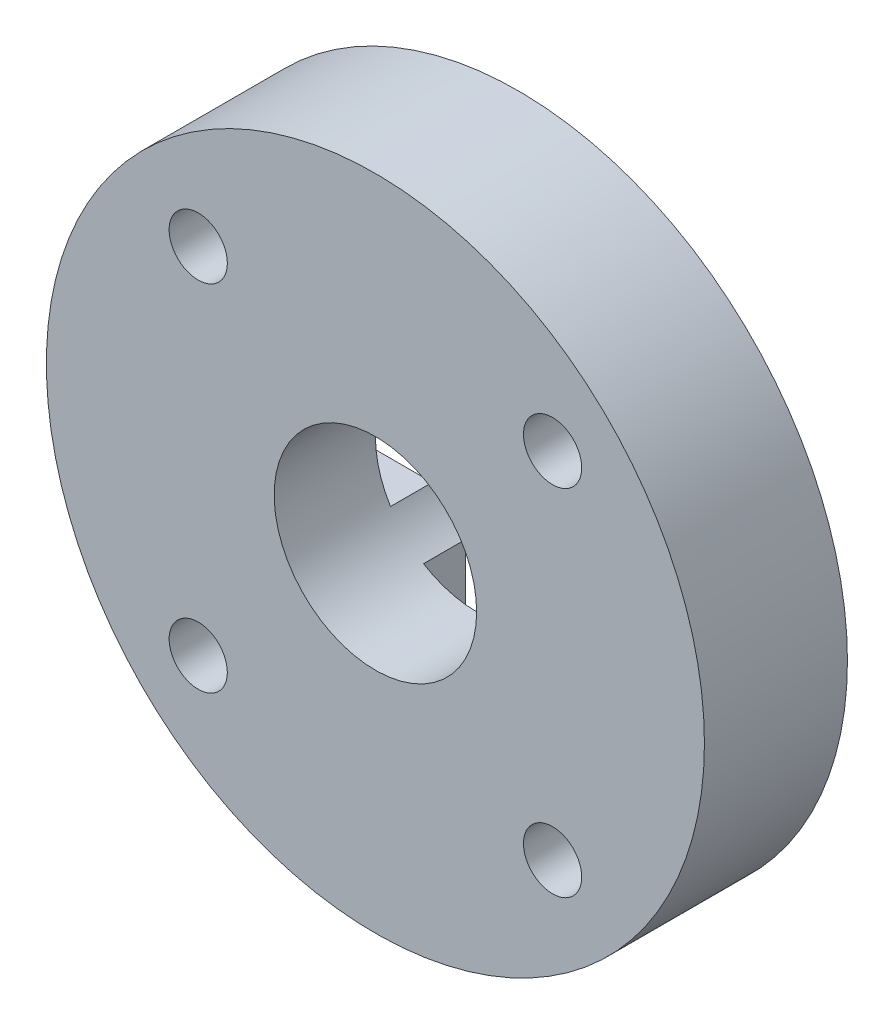
ISO-10303-21;
HEADER;
FILE_DESCRIPTION(('STEP AP214'),'2;1');
FILE_NAME('part.step','',(''),(''),'','','');
FILE_SCHEMA(('AUTOMOTIVE_DESIGN { 1 0 10303 214 1 1 1 1 }'));
ENDSEC;
DATA;
#1=APPLICATION_CONTEXT('core data for automotive mechanical design processes');
#2=APPLICATION_PROTOCOL_DEFINITION('international standard','automotive_design',2000,#1);
#3=PRODUCT_CONTEXT('',#1,'mechanical');
#4=PRODUCT('Part','Part','',(#3));
#5=PRODUCT_RELATED_PRODUCT_CATEGORY('part','',(#4));
#6=PRODUCT_DEFINITION_FORMATION('','',#4);
#7=PRODUCT_DEFINITION_CONTEXT('part definition',#1,'design');
#8=PRODUCT_DEFINITION('design','',#6,#7);
#9=PRODUCT_DEFINITION_SHAPE('','',#8);
#10=(LENGTH_UNIT() NAMED_UNIT(*) SI_UNIT(.MILLI.,.METRE.));
#11=(NAMED_UNIT(*) PLANE_ANGLE_UNIT() SI_UNIT($,.RADIAN.));
#12=(NAMED_UNIT(*) SI_UNIT($,.STERADIAN.) SOLID_ANGLE_UNIT());
#13=UNCERTAINTY_MEASURE_WITH_UNIT(LENGTH_MEASURE(1.E-05),#10,'distance_accuracy_value','');
#14=(GEOMETRIC_REPRESENTATION_CONTEXT(3) GLOBAL_UNCERTAINTY_ASSIGNED_CONTEXT((#13)) GLOBAL_UNIT_ASSIGNED_CONTEXT((#10,
#11,#12)) REPRESENTATION_CONTEXT('',''));
#15=CARTESIAN_POINT('',(0.,0.,0.));
#16=DIRECTION('',(0.,0.,1.));
#17=DIRECTION('',(1.,0.,0.));
#18=AXIS2_PLACEMENT_3D('',#15,#16,#17);
#19=CARTESIAN_POINT('',(0.,0.,-1.65));
#20=DIRECTION('',(0.,0.,1.));
#21=DIRECTION('',(1.,0.,0.));
#22=AXIS2_PLACEMENT_3D('',#19,#20,#21);
#23=PLANE('',#22);
#24=CARTESIAN_POINT('',(7.,-7.,-1.65));
#25=DIRECTION('',(0.,0.,1.));
#26=DIRECTION('',(1.,0.,0.));
#27=AXIS2_PLACEMENT_3D('',#24,#25,#26);
#28=CIRCLE('',#27,1.15);
#29=CARTESIAN_POINT('',(8.15,-7.,-1.65));
#30=VERTEX_POINT('',#29);
#31=EDGE_CURVE('E268',#30,#30,#28,.F.);
#32=ORIENTED_EDGE('',*,*,#31,.F.);
#33=EDGE_LOOP('',(#32));
#34=FACE_BOUND('',#33,.T.);
#35=CARTESIAN_POINT('',(-7.,-7.,-1.65));
#36=DIRECTION('',(0.,0.,1.));
#37=DIRECTION('',(1.,0.,0.));
#38=AXIS2_PLACEMENT_3D('',#35,#36,#37);
#39=CIRCLE('',#38,1.15);
#40=CARTESIAN_POINT('',(-5.85,-7.,-1.65));
#41=VERTEX_POINT('',#40);
#42=EDGE_CURVE('E289',#41,#41,#39,.F.);
#43=ORIENTED_EDGE('',*,*,#42,.F.);
#44=EDGE_LOOP('',(#43));
#45=FACE_BOUND('',#44,.T.);
#46=CARTESIAN_POINT('',(-7.,7.,-1.65));
#47=DIRECTION('',(0.,0.,1.));
#48=DIRECTION('',(1.,0.,0.));
#49=AXIS2_PLACEMENT_3D('',#46,#47,#48);
#50=CIRCLE('',#49,1.15);
#51=CARTESIAN_POINT('',(-5.85,7.,-1.65));
#52=VERTEX_POINT('',#51);
#53=EDGE_CURVE('E291',#52,#52,#50,.F.);
#54=ORIENTED_EDGE('',*,*,#53,.F.);
#55=EDGE_LOOP('',(#54));
#56=FACE_BOUND('',#55,.T.);
#57=CARTESIAN_POINT('',(7.,7.,-1.65));
#58=DIRECTION('',(0.,0.,1.));
#59=DIRECTION('',(1.,0.,0.));
#60=AXIS2_PLACEMENT_3D('',#57,#58,#59);
#61=CIRCLE('',#60,1.15);
#62=CARTESIAN_POINT('',(8.15,7.,-1.65));
#63=VERTEX_POINT('',#62);
#64=EDGE_CURVE('E300',#63,#63,#61,.F.);
#65=ORIENTED_EDGE('',*,*,#64,.F.);
#66=EDGE_LOOP('',(#65));
#67=FACE_BOUND('',#66,.T.);
#68=CARTESIAN_POINT('',(0.,0.,-1.65));
#69=DIRECTION('',(0.,0.,1.));
#70=DIRECTION('',(1.,0.,0.));
#71=AXIS2_PLACEMENT_3D('',#68,#69,#70);
#72=CIRCLE('',#71,13.);
#73=CARTESIAN_POINT('',(13.,0.,-1.65));
#74=VERTEX_POINT('',#73);
#75=EDGE_CURVE('E215',#74,#74,#72,.T.);
#76=ORIENTED_EDGE('',*,*,#75,.F.);
#77=EDGE_LOOP('',(#76));
#78=FACE_BOUND('',#77,.T.);
#79=DIRECTION('',(-1.,0.,0.));
#80=VECTOR('',#79,1.);
#81=CARTESIAN_POINT('',(-8.15,2.1,-1.65));
#82=LINE('',#81,#80);
#83=CARTESIAN_POINT('',(8.15,2.1,-1.65));
#84=VERTEX_POINT('',#83);
#85=CARTESIAN_POINT('',(3.40440890610984,2.1,-1.65));
#86=VERTEX_POINT('',#85);
#87=EDGE_CURVE('E172',#84,#86,#82,.T.);
#88=ORIENTED_EDGE('',*,*,#87,.T.);
#89=CARTESIAN_POINT('',(0.,0.,-1.65));
#90=DIRECTION('',(0.,0.,1.));
#91=DIRECTION('',(1.,0.,0.));
#92=AXIS2_PLACEMENT_3D('',#89,#90,#91);
#93=CIRCLE('',#92,4.);
#94=CARTESIAN_POINT('',(2.1,3.40440890610984,-1.65));
#95=VERTEX_POINT('',#94);
#96=EDGE_CURVE('E151',#86,#95,#93,.T.);
#97=ORIENTED_EDGE('',*,*,#96,.T.);
#98=DIRECTION('',(0.,1.,0.));
#99=VECTOR('',#98,1.);
#100=CARTESIAN_POINT('',(2.1,-8.15,-1.65));
#101=LINE('',#100,#99);
#102=CARTESIAN_POINT('',(2.1,8.15,-1.65));
#103=VERTEX_POINT('',#102);
#104=EDGE_CURVE('E226',#95,#103,#101,.T.);
#105=ORIENTED_EDGE('',*,*,#104,.T.);
#106=CARTESIAN_POINT('',(0.,8.15,-1.65));
#107=DIRECTION('',(0.,0.,1.));
#108=DIRECTION('',(1.,0.,0.));
#109=AXIS2_PLACEMENT_3D('',#106,#107,#108);
#110=CIRCLE('',#109,2.1);
#111=CARTESIAN_POINT('',(-2.1,8.15,-1.65));
#112=VERTEX_POINT('',#111);
#113=EDGE_CURVE('E274',#103,#112,#110,.T.);
#114=ORIENTED_EDGE('',*,*,#113,.T.);
#115=DIRECTION('',(0.,-1.,0.));
#116=VECTOR('',#115,1.);
#117=CARTESIAN_POINT('',(-2.1,-8.15,-1.65));
#118=LINE('',#117,#116);
#119=CARTESIAN_POINT('',(-2.1,3.40440890610984,-1.65));
#120=VERTEX_POINT('',#119);
#121=EDGE_CURVE('E238',#112,#120,#118,.T.);
#122=ORIENTED_EDGE('',*,*,#121,.T.);
#123=CARTESIAN_POINT('',(-3.40440890610984,2.1,-1.65));
#124=VERTEX_POINT('',#123);
#125=EDGE_CURVE('E62',#120,#124,#93,.T.);
#126=ORIENTED_EDGE('',*,*,#125,.T.);
#127=CARTESIAN_POINT('',(-8.15,2.1,-1.65));
#128=VERTEX_POINT('',#127);
#129=EDGE_CURVE('E187',#124,#128,#82,.T.);
#130=ORIENTED_EDGE('',*,*,#129,.T.);
#131=CARTESIAN_POINT('',(-8.15,0.,-1.65));
#132=DIRECTION('',(0.,0.,1.));
#133=DIRECTION('',(1.,0.,0.));
#134=AXIS2_PLACEMENT_3D('',#131,#132,#133);
#135=CIRCLE('',#134,2.1);
#136=CARTESIAN_POINT('',(-8.15,-2.1,-1.65));
#137=VERTEX_POINT('',#136);
#138=EDGE_CURVE('E278',#128,#137,#135,.T.);
#139=ORIENTED_EDGE('',*,*,#138,.T.);
#140=DIRECTION('',(1.,0.,0.));
#141=VECTOR('',#140,1.);
#142=CARTESIAN_POINT('',(-8.15,-2.1,-1.65));
#143=LINE('',#142,#141);
#144=CARTESIAN_POINT('',(-3.40440890610984,-2.1,-1.65));
#145=VERTEX_POINT('',#144);
#146=EDGE_CURVE('E194',#137,#145,#143,.T.);
#147=ORIENTED_EDGE('',*,*,#146,.T.);
#148=CARTESIAN_POINT('',(-2.1,-3.40440890610984,-1.65));
#149=VERTEX_POINT('',#148);
#150=EDGE_CURVE('E637',#145,#149,#93,.T.);
#151=ORIENTED_EDGE('',*,*,#150,.T.);
#152=CARTESIAN_POINT('',(-2.1,-8.15,-1.65));
#153=VERTEX_POINT('',#152);
#154=EDGE_CURVE('E53',#149,#153,#118,.T.);
#155=ORIENTED_EDGE('',*,*,#154,.T.);
#156=CARTESIAN_POINT('',(0.,-8.15,-1.65));
#157=DIRECTION('',(0.,0.,1.));
#158=DIRECTION('',(1.,0.,0.));
#159=AXIS2_PLACEMENT_3D('',#156,#157,#158);
#160=CIRCLE('',#159,2.1);
#161=CARTESIAN_POINT('',(2.1,-8.15,-1.65));
#162=VERTEX_POINT('',#161);
#163=EDGE_CURVE('E270',#153,#162,#160,.T.);
#164=ORIENTED_EDGE('',*,*,#163,.T.);
#165=CARTESIAN_POINT('',(2.1,-3.40440890610984,-1.65));
#166=VERTEX_POINT('',#165);
#167=EDGE_CURVE('E231',#162,#166,#101,.T.);
#168=ORIENTED_EDGE('',*,*,#167,.T.);
#169=CARTESIAN_POINT('',(3.40440890610984,-2.1,-1.65));
#170=VERTEX_POINT('',#169);
#171=EDGE_CURVE('E67',#166,#170,#93,.T.);
#172=ORIENTED_EDGE('',*,*,#171,.T.);
#173=CARTESIAN_POINT('',(8.15,-2.1,-1.65));
#174=VERTEX_POINT('',#173);
#175=EDGE_CURVE('E354',#170,#174,#143,.T.);
#176=ORIENTED_EDGE('',*,*,#175,.T.);
#177=CARTESIAN_POINT('',(8.15,0.,-1.65));
#178=DIRECTION('',(0.,0.,1.));
#179=DIRECTION('',(1.,0.,0.));
#180=AXIS2_PLACEMENT_3D('',#177,#178,#179);
#181=CIRCLE('',#180,2.1);
#182=EDGE_CURVE('E182',#174,#84,#181,.T.);
#183=ORIENTED_EDGE('',*,*,#182,.T.);
#184=EDGE_LOOP('',(#88,#97,#105,#114,#122,#126,#130,#139,#147,#151,#155,#164,#168,#172,#176,#183));
#185=FACE_BOUND('',#184,.T.);
#186=ADVANCED_FACE('F44',(#34,#45,#56,#67,#78,#185),#23,.F.);
#187=CARTESIAN_POINT('',(-8.15,-2.1,0.));
#188=DIRECTION('',(0.,1.,0.));
#189=DIRECTION('',(0.,0.,1.));
#190=AXIS2_PLACEMENT_3D('',#187,#188,#189);
#191=PLANE('',#190);
#192=ORIENTED_EDGE('',*,*,#175,.F.);
#193=DIRECTION('',(0.,0.,-1.));
#194=VECTOR('',#193,1.);
#195=CARTESIAN_POINT('',(3.40440890610984,-2.1,0.));
#196=LINE('',#195,#194);
#197=CARTESIAN_POINT('',(3.40440890610984,-2.1,0.));
#198=VERTEX_POINT('',#197);
#199=EDGE_CURVE('E178',#170,#198,#196,.F.);
#200=ORIENTED_EDGE('',*,*,#199,.T.);
#201=DIRECTION('',(1.,0.,0.));
#202=VECTOR('',#201,1.);
#203=CARTESIAN_POINT('',(-8.15,-2.1,0.));
#204=LINE('',#203,#202);
#205=CARTESIAN_POINT('',(8.15,-2.1,0.));
#206=VERTEX_POINT('',#205);
#207=EDGE_CURVE('E184',#198,#206,#204,.T.);
#208=ORIENTED_EDGE('',*,*,#207,.T.);
#209=DIRECTION('',(0.,0.,-1.));
#210=VECTOR('',#209,1.);
#211=CARTESIAN_POINT('',(8.15,-2.1,0.));
#212=LINE('',#211,#210);
#213=EDGE_CURVE('E204',#206,#174,#212,.T.);
#214=ORIENTED_EDGE('',*,*,#213,.T.);
#215=EDGE_LOOP('',(#192,#200,#208,#214));
#216=FACE_BOUND('',#215,.T.);
#217=ADVANCED_FACE('F407',(#216),#191,.T.);
#218=CARTESIAN_POINT('',(-8.15,2.1,0.));
#219=DIRECTION('',(0.,-1.,0.));
#220=DIRECTION('',(0.,0.,-1.));
#221=AXIS2_PLACEMENT_3D('',#218,#219,#220);
#222=PLANE('',#221);
#223=DIRECTION('',(-1.,0.,0.));
#224=VECTOR('',#223,1.);
#225=CARTESIAN_POINT('',(-8.15,2.1,0.));
#226=LINE('',#225,#224);
#227=CARTESIAN_POINT('',(8.15,2.1,0.));
#228=VERTEX_POINT('',#227);
#229=CARTESIAN_POINT('',(3.40440890610984,2.1,0.));
#230=VERTEX_POINT('',#229);
#231=EDGE_CURVE('E176',#228,#230,#226,.T.);
#232=ORIENTED_EDGE('',*,*,#231,.T.);
#233=DIRECTION('',(0.,0.,-1.));
#234=VECTOR('',#233,1.);
#235=CARTESIAN_POINT('',(3.40440890610984,2.1,0.));
#236=LINE('',#235,#234);
#237=EDGE_CURVE('E156',#230,#86,#236,.T.);
#238=ORIENTED_EDGE('',*,*,#237,.T.);
#239=ORIENTED_EDGE('',*,*,#87,.F.);
#240=DIRECTION('',(0.,0.,-1.));
#241=VECTOR('',#240,1.);
#242=CARTESIAN_POINT('',(8.15,2.1,0.));
#243=LINE('',#242,#241);
#244=EDGE_CURVE('E202',#228,#84,#243,.T.);
#245=ORIENTED_EDGE('',*,*,#244,.F.);
#246=EDGE_LOOP('',(#232,#238,#239,#245));
#247=FACE_BOUND('',#246,.T.);
#248=ADVANCED_FACE('F175',(#247),#222,.T.);
#249=ORIENTED_EDGE('',*,*,#129,.F.);
#250=DIRECTION('',(0.,0.,-1.));
#251=VECTOR('',#250,1.);
#252=CARTESIAN_POINT('',(-3.40440890610984,2.1,0.));
#253=LINE('',#252,#251);
#254=CARTESIAN_POINT('',(-3.40440890610984,2.1,0.));
#255=VERTEX_POINT('',#254);
#256=EDGE_CURVE('E177',#124,#255,#253,.F.);
#257=ORIENTED_EDGE('',*,*,#256,.T.);
#258=CARTESIAN_POINT('',(-8.15,2.1,0.));
#259=VERTEX_POINT('',#258);
#260=EDGE_CURVE('E359',#255,#259,#226,.T.);
#261=ORIENTED_EDGE('',*,*,#260,.T.);
#262=DIRECTION('',(0.,0.,-1.));
#263=VECTOR('',#262,1.);
#264=CARTESIAN_POINT('',(-8.15,2.1,0.));
#265=LINE('',#264,#263);
#266=EDGE_CURVE('E199',#259,#128,#265,.T.);
#267=ORIENTED_EDGE('',*,*,#266,.T.);
#268=EDGE_LOOP('',(#249,#257,#261,#267));
#269=FACE_BOUND('',#268,.T.);
#270=ADVANCED_FACE('F370',(#269),#222,.T.);
#271=CARTESIAN_POINT('',(-8.15,-2.1,0.));
#272=VERTEX_POINT('',#271);
#273=CARTESIAN_POINT('',(-3.40440890610984,-2.1,0.));
#274=VERTEX_POINT('',#273);
#275=EDGE_CURVE('E192',#272,#274,#204,.T.);
#276=ORIENTED_EDGE('',*,*,#275,.T.);
#277=DIRECTION('',(0.,0.,-1.));
#278=VECTOR('',#277,1.);
#279=CARTESIAN_POINT('',(-3.40440890610984,-2.1,0.));
#280=LINE('',#279,#278);
#281=EDGE_CURVE('E322',#274,#145,#280,.T.);
#282=ORIENTED_EDGE('',*,*,#281,.T.);
#283=ORIENTED_EDGE('',*,*,#146,.F.);
#284=DIRECTION('',(0.,0.,-1.));
#285=VECTOR('',#284,1.);
#286=CARTESIAN_POINT('',(-8.15,-2.1,0.));
#287=LINE('',#286,#285);
#288=EDGE_CURVE('E206',#272,#137,#287,.T.);
#289=ORIENTED_EDGE('',*,*,#288,.F.);
#290=EDGE_LOOP('',(#276,#282,#283,#289));
#291=FACE_BOUND('',#290,.T.);
#292=ADVANCED_FACE('F411',(#291),#191,.T.);
#293=CARTESIAN_POINT('',(2.1,-8.15,0.));
#294=DIRECTION('',(-1.,0.,0.));
#295=DIRECTION('',(0.,0.,1.));
#296=AXIS2_PLACEMENT_3D('',#293,#294,#295);
#297=PLANE('',#296);
#298=ORIENTED_EDGE('',*,*,#104,.F.);
#299=DIRECTION('',(0.,0.,-1.));
#300=VECTOR('',#299,1.);
#301=CARTESIAN_POINT('',(2.1,3.40440890610984,0.));
#302=LINE('',#301,#300);
#303=CARTESIAN_POINT('',(2.1,3.40440890610984,0.));
#304=VERTEX_POINT('',#303);
#305=EDGE_CURVE('E162',#95,#304,#302,.F.);
#306=ORIENTED_EDGE('',*,*,#305,.T.);
#307=DIRECTION('',(0.,1.,0.));
#308=VECTOR('',#307,1.);
#309=CARTESIAN_POINT('',(2.1,-8.15,0.));
#310=LINE('',#309,#308);
#311=CARTESIAN_POINT('',(2.1,8.15,0.));
#312=VERTEX_POINT('',#311);
#313=EDGE_CURVE('E258',#304,#312,#310,.T.);
#314=ORIENTED_EDGE('',*,*,#313,.T.);
#315=DIRECTION('',(0.,0.,-1.));
#316=VECTOR('',#315,1.);
#317=CARTESIAN_POINT('',(2.1,8.15,0.));
#318=LINE('',#317,#316);
#319=EDGE_CURVE('E346',#312,#103,#318,.T.);
#320=ORIENTED_EDGE('',*,*,#319,.T.);
#321=EDGE_LOOP('',(#298,#306,#314,#320));
#322=FACE_BOUND('',#321,.T.);
#323=ADVANCED_FACE('F393',(#322),#297,.T.);
#324=CARTESIAN_POINT('',(-2.1,-8.15,0.));
#325=DIRECTION('',(1.,0.,0.));
#326=DIRECTION('',(0.,0.,-1.));
#327=AXIS2_PLACEMENT_3D('',#324,#325,#326);
#328=PLANE('',#327);
#329=DIRECTION('',(0.,-1.,0.));
#330=VECTOR('',#329,1.);
#331=CARTESIAN_POINT('',(-2.1,-8.15,0.));
#332=LINE('',#331,#330);
#333=CARTESIAN_POINT('',(-2.1,8.15,0.));
#334=VERTEX_POINT('',#333);
#335=CARTESIAN_POINT('',(-2.1,3.40440890610984,0.));
#336=VERTEX_POINT('',#335);
#337=EDGE_CURVE('E247',#334,#336,#332,.T.);
#338=ORIENTED_EDGE('',*,*,#337,.T.);
#339=DIRECTION('',(0.,0.,-1.));
#340=VECTOR('',#339,1.);
#341=CARTESIAN_POINT('',(-2.1,3.40440890610984,0.));
#342=LINE('',#341,#340);
#343=EDGE_CURVE('E329',#336,#120,#342,.T.);
#344=ORIENTED_EDGE('',*,*,#343,.T.);
#345=ORIENTED_EDGE('',*,*,#121,.F.);
#346=DIRECTION('',(0.,0.,-1.));
#347=VECTOR('',#346,1.);
#348=CARTESIAN_POINT('',(-2.1,8.15,0.));
#349=LINE('',#348,#347);
#350=EDGE_CURVE('E256',#334,#112,#349,.T.);
#351=ORIENTED_EDGE('',*,*,#350,.F.);
#352=EDGE_LOOP('',(#338,#344,#345,#351));
#353=FACE_BOUND('',#352,.T.);
#354=ADVANCED_FACE('F387',(#353),#328,.T.);
#355=ORIENTED_EDGE('',*,*,#154,.F.);
#356=DIRECTION('',(0.,0.,-1.));
#357=VECTOR('',#356,1.);
#358=CARTESIAN_POINT('',(-2.1,-3.40440890610984,0.));
#359=LINE('',#358,#357);
#360=CARTESIAN_POINT('',(-2.1,-3.40440890610984,0.));
#361=VERTEX_POINT('',#360);
#362=EDGE_CURVE('E170',#149,#361,#359,.F.);
#363=ORIENTED_EDGE('',*,*,#362,.T.);
#364=CARTESIAN_POINT('',(-2.1,-8.15,0.));
#365=VERTEX_POINT('',#364);
#366=EDGE_CURVE('E245',#361,#365,#332,.T.);
#367=ORIENTED_EDGE('',*,*,#366,.T.);
#368=DIRECTION('',(0.,0.,-1.));
#369=VECTOR('',#368,1.);
#370=CARTESIAN_POINT('',(-2.1,-8.15,0.));
#371=LINE('',#370,#369);
#372=EDGE_CURVE('E350',#365,#153,#371,.T.);
#373=ORIENTED_EDGE('',*,*,#372,.T.);
#374=EDGE_LOOP('',(#355,#363,#367,#373));
#375=FACE_BOUND('',#374,.T.);
#376=ADVANCED_FACE('F334',(#375),#328,.T.);
#377=CARTESIAN_POINT('',(2.1,-8.15,0.));
#378=VERTEX_POINT('',#377);
#379=CARTESIAN_POINT('',(2.1,-3.40440890610984,0.));
#380=VERTEX_POINT('',#379);
#381=EDGE_CURVE('E257',#378,#380,#310,.T.);
#382=ORIENTED_EDGE('',*,*,#381,.T.);
#383=DIRECTION('',(0.,0.,-1.));
#384=VECTOR('',#383,1.);
#385=CARTESIAN_POINT('',(2.1,-3.40440890610984,0.));
#386=LINE('',#385,#384);
#387=EDGE_CURVE('E11',#380,#166,#386,.T.);
#388=ORIENTED_EDGE('',*,*,#387,.T.);
#389=ORIENTED_EDGE('',*,*,#167,.F.);
#390=DIRECTION('',(0.,0.,-1.));
#391=VECTOR('',#390,1.);
#392=CARTESIAN_POINT('',(2.1,-8.15,0.));
#393=LINE('',#392,#391);
#394=EDGE_CURVE('E343',#378,#162,#393,.T.);
#395=ORIENTED_EDGE('',*,*,#394,.F.);
#396=EDGE_LOOP('',(#382,#388,#389,#395));
#397=FACE_BOUND('',#396,.T.);
#398=ADVANCED_FACE('F344',(#397),#297,.T.);
#399=CARTESIAN_POINT('',(0.,0.,4.));
#400=DIRECTION('',(0.,0.,1.));
#401=DIRECTION('',(1.,0.,0.));
#402=AXIS2_PLACEMENT_3D('',#399,#400,#401);
#403=PLANE('',#402);
#404=CARTESIAN_POINT('',(7.,-7.,4.));
#405=DIRECTION('',(0.,0.,1.));
#406=DIRECTION('',(1.,0.,0.));
#407=AXIS2_PLACEMENT_3D('',#404,#405,#406);
#408=CIRCLE('',#407,1.15);
#409=CARTESIAN_POINT('',(8.15,-7.,4.));
#410=VERTEX_POINT('',#409);
#411=EDGE_CURVE('E306',#410,#410,#408,.T.);
#412=ORIENTED_EDGE('',*,*,#411,.F.);
#413=EDGE_LOOP('',(#412));
#414=FACE_BOUND('',#413,.T.);
#415=CARTESIAN_POINT('',(-7.,-7.,4.));
#416=DIRECTION('',(0.,0.,1.));
#417=DIRECTION('',(1.,0.,0.));
#418=AXIS2_PLACEMENT_3D('',#415,#416,#417);
#419=CIRCLE('',#418,1.15);
#420=CARTESIAN_POINT('',(-5.85,-7.,4.));
#421=VERTEX_POINT('',#420);
#422=EDGE_CURVE('E309',#421,#421,#419,.T.);
#423=ORIENTED_EDGE('',*,*,#422,.F.);
#424=EDGE_LOOP('',(#423));
#425=FACE_BOUND('',#424,.T.);
#426=CARTESIAN_POINT('',(-7.,7.,4.));
#427=DIRECTION('',(0.,0.,1.));
#428=DIRECTION('',(1.,0.,0.));
#429=AXIS2_PLACEMENT_3D('',#426,#427,#428);
#430=CIRCLE('',#429,1.15);
#431=CARTESIAN_POINT('',(-5.85,7.,4.));
#432=VERTEX_POINT('',#431);
#433=EDGE_CURVE('E304',#432,#432,#430,.T.);
#434=ORIENTED_EDGE('',*,*,#433,.F.);
#435=EDGE_LOOP('',(#434));
#436=FACE_BOUND('',#435,.T.);
#437=CARTESIAN_POINT('',(7.,7.,4.));
#438=DIRECTION('',(0.,0.,1.));
#439=DIRECTION('',(1.,0.,0.));
#440=AXIS2_PLACEMENT_3D('',#437,#438,#439);
#441=CIRCLE('',#440,1.15);
#442=CARTESIAN_POINT('',(8.15,7.,4.));
#443=VERTEX_POINT('',#442);
#444=EDGE_CURVE('E301',#443,#443,#441,.T.);
#445=ORIENTED_EDGE('',*,*,#444,.F.);
#446=EDGE_LOOP('',(#445));
#447=FACE_BOUND('',#446,.T.);
#448=CARTESIAN_POINT('',(0.,0.,4.));
#449=DIRECTION('',(0.,0.,1.));
#450=DIRECTION('',(1.,0.,0.));
#451=AXIS2_PLACEMENT_3D('',#448,#449,#450);
#452=CIRCLE('',#451,13.);
#453=CARTESIAN_POINT('',(13.,0.,4.));
#454=VERTEX_POINT('',#453);
#455=EDGE_CURVE('E225',#454,#454,#452,.T.);
#456=ORIENTED_EDGE('',*,*,#455,.T.);
#457=EDGE_LOOP('',(#456));
#458=FACE_BOUND('',#457,.T.);
#459=CARTESIAN_POINT('',(0.,0.,4.));
#460=DIRECTION('',(0.,0.,1.));
#461=DIRECTION('',(1.,0.,0.));
#462=AXIS2_PLACEMENT_3D('',#459,#460,#461);
#463=CIRCLE('',#462,4.);
#464=CARTESIAN_POINT('',(4.,0.,4.));
#465=VERTEX_POINT('',#464);
#466=EDGE_CURVE('E217',#465,#465,#463,.T.);
#467=ORIENTED_EDGE('',*,*,#466,.F.);
#468=EDGE_LOOP('',(#467));
#469=FACE_BOUND('',#468,.T.);
#470=ADVANCED_FACE('F421',(#414,#425,#436,#447,#458,#469),#403,.T.);
#471=CARTESIAN_POINT('',(0.,0.,4.));
#472=DIRECTION('',(0.,0.,-1.));
#473=DIRECTION('',(-1.,0.,0.));
#474=AXIS2_PLACEMENT_3D('',#471,#472,#473);
#475=CYLINDRICAL_SURFACE('',#474,13.);
#476=ORIENTED_EDGE('',*,*,#455,.F.);
#477=EDGE_LOOP('',(#476));
#478=FACE_BOUND('',#477,.T.);
#479=ORIENTED_EDGE('',*,*,#75,.T.);
#480=EDGE_LOOP('',(#479));
#481=FACE_BOUND('',#480,.T.);
#482=ADVANCED_FACE('F50',(#478,#481),#475,.T.);
#483=CARTESIAN_POINT('',(0.,0.,4.));
#484=DIRECTION('',(0.,0.,-1.));
#485=DIRECTION('',(-1.,0.,0.));
#486=AXIS2_PLACEMENT_3D('',#483,#484,#485);
#487=CYLINDRICAL_SURFACE('',#486,4.);
#488=ORIENTED_EDGE('',*,*,#466,.T.);
#489=EDGE_LOOP('',(#488));
#490=FACE_BOUND('',#489,.T.);
#491=CARTESIAN_POINT('',(0.,0.,0.));
#492=DIRECTION('',(0.,0.,1.));
#493=DIRECTION('',(1.,0.,0.));
#494=AXIS2_PLACEMENT_3D('',#491,#492,#493);
#495=CIRCLE('',#494,4.);
#496=EDGE_CURVE('E223',#304,#336,#495,.T.);
#497=ORIENTED_EDGE('',*,*,#496,.F.);
#498=ORIENTED_EDGE('',*,*,#305,.F.);
#499=ORIENTED_EDGE('',*,*,#96,.F.);
#500=ORIENTED_EDGE('',*,*,#237,.F.);
#501=EDGE_CURVE('E212',#198,#230,#495,.T.);
#502=ORIENTED_EDGE('',*,*,#501,.F.);
#503=ORIENTED_EDGE('',*,*,#199,.F.);
#504=ORIENTED_EDGE('',*,*,#171,.F.);
#505=ORIENTED_EDGE('',*,*,#387,.F.);
#506=EDGE_CURVE('E218',#361,#380,#495,.T.);
#507=ORIENTED_EDGE('',*,*,#506,.F.);
#508=ORIENTED_EDGE('',*,*,#362,.F.);
#509=ORIENTED_EDGE('',*,*,#150,.F.);
#510=ORIENTED_EDGE('',*,*,#281,.F.);
#511=EDGE_CURVE('E219',#255,#274,#495,.T.);
#512=ORIENTED_EDGE('',*,*,#511,.F.);
#513=ORIENTED_EDGE('',*,*,#256,.F.);
#514=ORIENTED_EDGE('',*,*,#125,.F.);
#515=ORIENTED_EDGE('',*,*,#343,.F.);
#516=EDGE_LOOP('',(#497,#498,#499,#500,#502,#503,#504,#505,#507,#508,#509,#510,#512,#513,#514,#515));
#517=FACE_BOUND('',#516,.T.);
#518=ADVANCED_FACE('F158',(#490,#517),#487,.F.);
#519=CARTESIAN_POINT('',(0.,0.,0.));
#520=DIRECTION('',(0.,0.,-1.));
#521=DIRECTION('',(-1.,0.,0.));
#522=AXIS2_PLACEMENT_3D('',#519,#520,#521);
#523=PLANE('',#522);
#524=ORIENTED_EDGE('',*,*,#231,.F.);
#525=CARTESIAN_POINT('',(8.15,0.,0.));
#526=DIRECTION('',(0.,0.,1.));
#527=DIRECTION('',(1.,0.,0.));
#528=AXIS2_PLACEMENT_3D('',#525,#526,#527);
#529=CIRCLE('',#528,2.1);
#530=EDGE_CURVE('E252',#206,#228,#529,.T.);
#531=ORIENTED_EDGE('',*,*,#530,.F.);
#532=ORIENTED_EDGE('',*,*,#207,.F.);
#533=ORIENTED_EDGE('',*,*,#501,.T.);
#534=EDGE_LOOP('',(#524,#531,#532,#533));
#535=FACE_BOUND('',#534,.T.);
#536=ADVANCED_FACE('F423',(#535),#523,.T.);
#537=ORIENTED_EDGE('',*,*,#275,.F.);
#538=CARTESIAN_POINT('',(-8.15,0.,0.));
#539=DIRECTION('',(0.,0.,1.));
#540=DIRECTION('',(1.,0.,0.));
#541=AXIS2_PLACEMENT_3D('',#538,#539,#540);
#542=CIRCLE('',#541,2.1);
#543=EDGE_CURVE('E280',#259,#272,#542,.T.);
#544=ORIENTED_EDGE('',*,*,#543,.F.);
#545=ORIENTED_EDGE('',*,*,#260,.F.);
#546=ORIENTED_EDGE('',*,*,#511,.T.);
#547=EDGE_LOOP('',(#537,#544,#545,#546));
#548=FACE_BOUND('',#547,.T.);
#549=ADVANCED_FACE('F373',(#548),#523,.T.);
#550=CARTESIAN_POINT('',(0.,0.,0.));
#551=DIRECTION('',(0.,0.,-1.));
#552=DIRECTION('',(-1.,0.,0.));
#553=AXIS2_PLACEMENT_3D('',#550,#551,#552);
#554=PLANE('',#553);
#555=ORIENTED_EDGE('',*,*,#337,.F.);
#556=CARTESIAN_POINT('',(0.,8.15,0.));
#557=DIRECTION('',(0.,0.,1.));
#558=DIRECTION('',(1.,0.,0.));
#559=AXIS2_PLACEMENT_3D('',#556,#557,#558);
#560=CIRCLE('',#559,2.1);
#561=EDGE_CURVE('E272',#312,#334,#560,.T.);
#562=ORIENTED_EDGE('',*,*,#561,.F.);
#563=ORIENTED_EDGE('',*,*,#313,.F.);
#564=ORIENTED_EDGE('',*,*,#496,.T.);
#565=EDGE_LOOP('',(#555,#562,#563,#564));
#566=FACE_BOUND('',#565,.T.);
#567=ADVANCED_FACE('F382',(#566),#554,.T.);
#568=ORIENTED_EDGE('',*,*,#381,.F.);
#569=CARTESIAN_POINT('',(0.,-8.15,0.));
#570=DIRECTION('',(0.,0.,1.));
#571=DIRECTION('',(1.,0.,0.));
#572=AXIS2_PLACEMENT_3D('',#569,#570,#571);
#573=CIRCLE('',#572,2.1);
#574=EDGE_CURVE('E265',#365,#378,#573,.T.);
#575=ORIENTED_EDGE('',*,*,#574,.F.);
#576=ORIENTED_EDGE('',*,*,#366,.F.);
#577=ORIENTED_EDGE('',*,*,#506,.T.);
#578=EDGE_LOOP('',(#568,#575,#576,#577));
#579=FACE_BOUND('',#578,.T.);
#580=ADVANCED_FACE('F342',(#579),#554,.T.);
#581=CARTESIAN_POINT('',(0.,-8.15,0.));
#582=DIRECTION('',(0.,0.,-1.));
#583=DIRECTION('',(-1.,0.,0.));
#584=AXIS2_PLACEMENT_3D('',#581,#582,#583);
#585=CYLINDRICAL_SURFACE('',#584,2.1);
#586=ORIENTED_EDGE('',*,*,#163,.F.);
#587=ORIENTED_EDGE('',*,*,#372,.F.);
#588=ORIENTED_EDGE('',*,*,#574,.T.);
#589=ORIENTED_EDGE('',*,*,#394,.T.);
#590=EDGE_LOOP('',(#586,#587,#588,#589));
#591=FACE_BOUND('',#590,.T.);
#592=ADVANCED_FACE('F391',(#591),#585,.F.);
#593=CARTESIAN_POINT('',(0.,8.15,0.));
#594=DIRECTION('',(0.,0.,-1.));
#595=DIRECTION('',(-1.,0.,0.));
#596=AXIS2_PLACEMENT_3D('',#593,#594,#595);
#597=CYLINDRICAL_SURFACE('',#596,2.1);
#598=ORIENTED_EDGE('',*,*,#319,.F.);
#599=ORIENTED_EDGE('',*,*,#561,.T.);
#600=ORIENTED_EDGE('',*,*,#350,.T.);
#601=ORIENTED_EDGE('',*,*,#113,.F.);
#602=EDGE_LOOP('',(#598,#599,#600,#601));
#603=FACE_BOUND('',#602,.T.);
#604=ADVANCED_FACE('F394',(#603),#597,.F.);
#605=CARTESIAN_POINT('',(-8.15,0.,0.));
#606=DIRECTION('',(0.,0.,-1.));
#607=DIRECTION('',(-1.,0.,0.));
#608=AXIS2_PLACEMENT_3D('',#605,#606,#607);
#609=CYLINDRICAL_SURFACE('',#608,2.1);
#610=ORIENTED_EDGE('',*,*,#543,.T.);
#611=ORIENTED_EDGE('',*,*,#288,.T.);
#612=ORIENTED_EDGE('',*,*,#138,.F.);
#613=ORIENTED_EDGE('',*,*,#266,.F.);
#614=EDGE_LOOP('',(#610,#611,#612,#613));
#615=FACE_BOUND('',#614,.T.);
#616=ADVANCED_FACE('F395',(#615),#609,.F.);
#617=CARTESIAN_POINT('',(8.15,0.,0.));
#618=DIRECTION('',(0.,0.,-1.));
#619=DIRECTION('',(-1.,0.,0.));
#620=AXIS2_PLACEMENT_3D('',#617,#618,#619);
#621=CYLINDRICAL_SURFACE('',#620,2.1);
#622=ORIENTED_EDGE('',*,*,#182,.F.);
#623=ORIENTED_EDGE('',*,*,#213,.F.);
#624=ORIENTED_EDGE('',*,*,#530,.T.);
#625=ORIENTED_EDGE('',*,*,#244,.T.);
#626=EDGE_LOOP('',(#622,#623,#624,#625));
#627=FACE_BOUND('',#626,.T.);
#628=ADVANCED_FACE('F402',(#627),#621,.F.);
#629=CARTESIAN_POINT('',(7.,7.,4.));
#630=DIRECTION('',(0.,0.,-1.));
#631=DIRECTION('',(-1.,0.,0.));
#632=AXIS2_PLACEMENT_3D('',#629,#630,#631);
#633=CYLINDRICAL_SURFACE('',#632,1.15);
#634=ORIENTED_EDGE('',*,*,#444,.T.);
#635=EDGE_LOOP('',(#634));
#636=FACE_BOUND('',#635,.T.);
#637=ORIENTED_EDGE('',*,*,#64,.T.);
#638=EDGE_LOOP('',(#637));
#639=FACE_BOUND('',#638,.T.);
#640=ADVANCED_FACE('F443',(#636,#639),#633,.F.);
#641=CARTESIAN_POINT('',(-7.,7.,4.));
#642=DIRECTION('',(0.,0.,-1.));
#643=DIRECTION('',(-1.,0.,0.));
#644=AXIS2_PLACEMENT_3D('',#641,#642,#643);
#645=CYLINDRICAL_SURFACE('',#644,1.15);
#646=ORIENTED_EDGE('',*,*,#433,.T.);
#647=EDGE_LOOP('',(#646));
#648=FACE_BOUND('',#647,.T.);
#649=ORIENTED_EDGE('',*,*,#53,.T.);
#650=EDGE_LOOP('',(#649));
#651=FACE_BOUND('',#650,.T.);
#652=ADVANCED_FACE('F447',(#648,#651),#645,.F.);
#653=CARTESIAN_POINT('',(-7.,-7.,4.));
#654=DIRECTION('',(0.,0.,-1.));
#655=DIRECTION('',(-1.,0.,0.));
#656=AXIS2_PLACEMENT_3D('',#653,#654,#655);
#657=CYLINDRICAL_SURFACE('',#656,1.15);
#658=ORIENTED_EDGE('',*,*,#422,.T.);
#659=EDGE_LOOP('',(#658));
#660=FACE_BOUND('',#659,.T.);
#661=ORIENTED_EDGE('',*,*,#42,.T.);
#662=EDGE_LOOP('',(#661));
#663=FACE_BOUND('',#662,.T.);
#664=ADVANCED_FACE('F458',(#660,#663),#657,.F.);
#665=CARTESIAN_POINT('',(7.,-7.,4.));
#666=DIRECTION('',(0.,0.,-1.));
#667=DIRECTION('',(-1.,0.,0.));
#668=AXIS2_PLACEMENT_3D('',#665,#666,#667);
#669=CYLINDRICAL_SURFACE('',#668,1.15);
#670=ORIENTED_EDGE('',*,*,#411,.T.);
#671=EDGE_LOOP('',(#670));
#672=FACE_BOUND('',#671,.T.);
#673=ORIENTED_EDGE('',*,*,#31,.T.);
#674=EDGE_LOOP('',(#673));
#675=FACE_BOUND('',#674,.T.);
#676=ADVANCED_FACE('F465',(#672,#675),#669,.F.);
#677=CLOSED_SHELL('',(#186,#217,#248,#270,#292,#323,#354,#376,#398,#470,#482,#518,#536,#549,
#567,#580,#592,#604,#616,#628,#640,#652,#664,#676));
#678=MANIFOLD_SOLID_BREP('B2',#677);
#679=ADVANCED_BREP_SHAPE_REPRESENTATION('',(#18,#678),#14);
#680=SHAPE_DEFINITION_REPRESENTATION(#9,#679);
ENDSEC;
END-ISO-10303-21;
